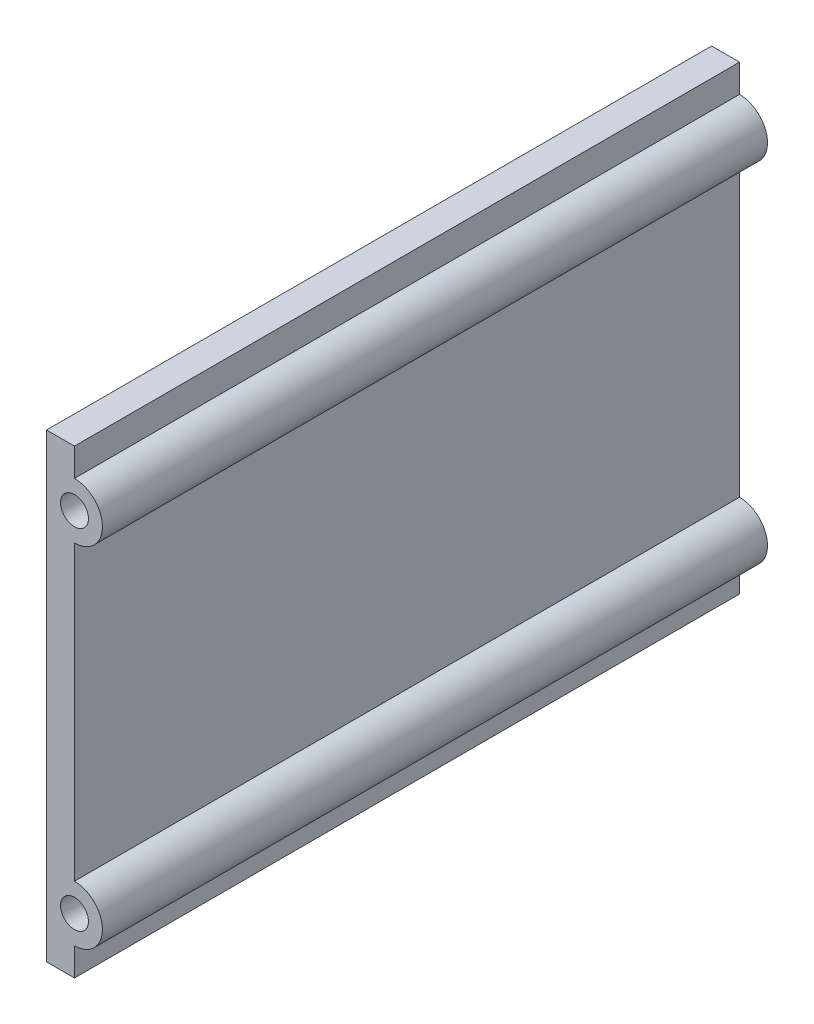
ISO-10303-21;
HEADER;
FILE_DESCRIPTION(('STEP AP214'),'2;1');
FILE_NAME('part.step','',(''),(''),'','','');
FILE_SCHEMA(('AUTOMOTIVE_DESIGN { 1 0 10303 214 1 1 1 1 }'));
ENDSEC;
DATA;
#1=APPLICATION_CONTEXT('core data for automotive mechanical design processes');
#2=APPLICATION_PROTOCOL_DEFINITION('international standard','automotive_design',2000,#1);
#3=PRODUCT_CONTEXT('',#1,'mechanical');
#4=PRODUCT('Part','Part','',(#3));
#5=PRODUCT_RELATED_PRODUCT_CATEGORY('part','',(#4));
#6=PRODUCT_DEFINITION_FORMATION('','',#4);
#7=PRODUCT_DEFINITION_CONTEXT('part definition',#1,'design');
#8=PRODUCT_DEFINITION('design','',#6,#7);
#9=PRODUCT_DEFINITION_SHAPE('','',#8);
#10=(LENGTH_UNIT() NAMED_UNIT(*) SI_UNIT(.MILLI.,.METRE.));
#11=(NAMED_UNIT(*) PLANE_ANGLE_UNIT() SI_UNIT($,.RADIAN.));
#12=(NAMED_UNIT(*) SI_UNIT($,.STERADIAN.) SOLID_ANGLE_UNIT());
#13=UNCERTAINTY_MEASURE_WITH_UNIT(LENGTH_MEASURE(1.E-05),#10,'distance_accuracy_value','');
#14=(GEOMETRIC_REPRESENTATION_CONTEXT(3) GLOBAL_UNCERTAINTY_ASSIGNED_CONTEXT((#13)) GLOBAL_UNIT_ASSIGNED_CONTEXT((#10,
#11,#12)) REPRESENTATION_CONTEXT('',''));
#15=CARTESIAN_POINT('',(0.,0.,0.));
#16=DIRECTION('',(0.,0.,1.));
#17=DIRECTION('',(1.,0.,0.));
#18=AXIS2_PLACEMENT_3D('',#15,#16,#17);
#19=CARTESIAN_POINT('',(-161.500000000327,31.210634294359,202.025691901636));
#20=DIRECTION('',(0.,0.,-1.));
#21=DIRECTION('',(-1.,0.,0.));
#22=AXIS2_PLACEMENT_3D('',#19,#20,#21);
#23=CYLINDRICAL_SURFACE('',#22,2.5);
#24=CARTESIAN_POINT('',(-161.500000000327,31.210634294359,0.));
#25=DIRECTION('',(0.,0.,1.));
#26=DIRECTION('',(1.,0.,0.));
#27=AXIS2_PLACEMENT_3D('',#24,#25,#26);
#28=CIRCLE('',#27,2.5);
#29=CARTESIAN_POINT('',(-159.000000000327,31.210634294359,0.));
#30=VERTEX_POINT('',#29);
#31=EDGE_CURVE('E140',#30,#30,#28,.T.);
#32=ORIENTED_EDGE('',*,*,#31,.F.);
#33=EDGE_LOOP('',(#32));
#34=FACE_BOUND('',#33,.T.);
#35=CARTESIAN_POINT('',(-161.500000000327,31.210634294359,118.999999999998));
#36=DIRECTION('',(0.,0.,1.));
#37=DIRECTION('',(0.,-1.,0.));
#38=AXIS2_PLACEMENT_3D('',#35,#36,#37);
#39=CIRCLE('',#38,2.5);
#40=CARTESIAN_POINT('',(-161.500000000327,28.710634294359,118.999999999998));
#41=VERTEX_POINT('',#40);
#42=EDGE_CURVE('E120',#41,#41,#39,.T.);
#43=ORIENTED_EDGE('',*,*,#42,.T.);
#44=EDGE_LOOP('',(#43));
#45=FACE_BOUND('',#44,.T.);
#46=ADVANCED_FACE('F35',(#34,#45),#23,.F.);
#47=CARTESIAN_POINT('',(-161.500000000317,26.2106342943589,202.025691901636));
#48=DIRECTION('',(-1.,0.,0.));
#49=DIRECTION('',(0.,0.,1.));
#50=AXIS2_PLACEMENT_3D('',#47,#48,#49);
#51=PLANE('',#50);
#52=DIRECTION('',(0.,1.,0.));
#53=VECTOR('',#52,1.);
#54=CARTESIAN_POINT('',(-161.500000000317,26.2106342943537,118.999999999998));
#55=LINE('',#54,#53);
#56=CARTESIAN_POINT('',(-161.500000000317,-26.2106342941675,119.));
#57=VERTEX_POINT('',#56);
#58=CARTESIAN_POINT('',(-161.500000000317,26.2106342943589,118.999999999998));
#59=VERTEX_POINT('',#58);
#60=EDGE_CURVE('E104',#57,#59,#55,.T.);
#61=ORIENTED_EDGE('',*,*,#60,.F.);
#62=DIRECTION('',(0.,0.,-1.));
#63=VECTOR('',#62,1.);
#64=CARTESIAN_POINT('',(-161.500000000317,-26.2106342941675,202.025691901636));
#65=LINE('',#64,#63);
#66=CARTESIAN_POINT('',(-161.500000000317,-26.2106342941675,0.));
#67=VERTEX_POINT('',#66);
#68=EDGE_CURVE('E51',#57,#67,#65,.T.);
#69=ORIENTED_EDGE('',*,*,#68,.T.);
#70=DIRECTION('',(0.,1.,0.));
#71=VECTOR('',#70,1.);
#72=CARTESIAN_POINT('',(-161.500000000317,26.2106342943589,0.));
#73=LINE('',#72,#71);
#74=CARTESIAN_POINT('',(-161.500000000317,26.2106342943589,0.));
#75=VERTEX_POINT('',#74);
#76=EDGE_CURVE('E107',#67,#75,#73,.T.);
#77=ORIENTED_EDGE('',*,*,#76,.T.);
#78=DIRECTION('',(0.,0.,-1.));
#79=VECTOR('',#78,1.);
#80=CARTESIAN_POINT('',(-161.500000000317,26.2106342943589,202.025691901636));
#81=LINE('',#80,#79);
#82=EDGE_CURVE('E100',#59,#75,#81,.T.);
#83=ORIENTED_EDGE('',*,*,#82,.F.);
#84=EDGE_LOOP('',(#61,#69,#77,#83));
#85=FACE_BOUND('',#84,.T.);
#86=ADVANCED_FACE('F102',(#85),#51,.F.);
#87=CARTESIAN_POINT('',(-161.500000000317,-31.2106342941764,202.025691901636));
#88=DIRECTION('',(0.,0.,-1.));
#89=DIRECTION('',(-1.,0.,0.));
#90=AXIS2_PLACEMENT_3D('',#87,#88,#89);
#91=CYLINDRICAL_SURFACE('',#90,5.00000000000894);
#92=CARTESIAN_POINT('',(-161.500000000317,-31.2106342941764,119.000000000002));
#93=DIRECTION('',(0.,0.,1.));
#94=DIRECTION('',(0.,-1.,0.));
#95=AXIS2_PLACEMENT_3D('',#92,#93,#94);
#96=CIRCLE('',#95,5.00000000000894);
#97=CARTESIAN_POINT('',(-161.500000000317,-36.2106342941854,119.000000000002));
#98=VERTEX_POINT('',#97);
#99=EDGE_CURVE('E119',#98,#57,#96,.T.);
#100=ORIENTED_EDGE('',*,*,#99,.F.);
#101=DIRECTION('',(0.,0.,-1.));
#102=VECTOR('',#101,1.);
#103=CARTESIAN_POINT('',(-161.500000000317,-36.2106342941854,202.025691901636));
#104=LINE('',#103,#102);
#105=CARTESIAN_POINT('',(-161.500000000317,-36.2106342941854,0.));
#106=VERTEX_POINT('',#105);
#107=EDGE_CURVE('E164',#98,#106,#104,.T.);
#108=ORIENTED_EDGE('',*,*,#107,.T.);
#109=CARTESIAN_POINT('',(-161.500000000317,-31.2106342941764,0.));
#110=DIRECTION('',(0.,0.,1.));
#111=DIRECTION('',(1.,0.,0.));
#112=AXIS2_PLACEMENT_3D('',#109,#110,#111);
#113=CIRCLE('',#112,5.00000000000894);
#114=EDGE_CURVE('E160',#106,#67,#113,.T.);
#115=ORIENTED_EDGE('',*,*,#114,.T.);
#116=ORIENTED_EDGE('',*,*,#68,.F.);
#117=EDGE_LOOP('',(#100,#108,#115,#116));
#118=FACE_BOUND('',#117,.T.);
#119=ADVANCED_FACE('F194',(#118),#91,.T.);
#120=CARTESIAN_POINT('',(-161.500000000317,-36.2106342941854,202.025691901636));
#121=DIRECTION('',(-1.,0.,0.));
#122=DIRECTION('',(0.,0.,1.));
#123=AXIS2_PLACEMENT_3D('',#120,#121,#122);
#124=PLANE('',#123);
#125=DIRECTION('',(0.,1.,0.));
#126=VECTOR('',#125,1.);
#127=CARTESIAN_POINT('',(-161.500000000317,-36.2106342941906,119.000000000002));
#128=LINE('',#127,#126);
#129=CARTESIAN_POINT('',(-161.500000000317,-41.2106342941854,119.000000000002));
#130=VERTEX_POINT('',#129);
#131=EDGE_CURVE('E122',#130,#98,#128,.T.);
#132=ORIENTED_EDGE('',*,*,#131,.F.);
#133=DIRECTION('',(0.,0.,-1.));
#134=VECTOR('',#133,1.);
#135=CARTESIAN_POINT('',(-161.500000000317,-41.2106342941854,202.025691901636));
#136=LINE('',#135,#134);
#137=CARTESIAN_POINT('',(-161.500000000317,-41.2106342941854,0.));
#138=VERTEX_POINT('',#137);
#139=EDGE_CURVE('E166',#130,#138,#136,.T.);
#140=ORIENTED_EDGE('',*,*,#139,.T.);
#141=DIRECTION('',(0.,1.,0.));
#142=VECTOR('',#141,1.);
#143=CARTESIAN_POINT('',(-161.500000000317,-36.2106342941854,0.));
#144=LINE('',#143,#142);
#145=EDGE_CURVE('E157',#138,#106,#144,.T.);
#146=ORIENTED_EDGE('',*,*,#145,.T.);
#147=ORIENTED_EDGE('',*,*,#107,.F.);
#148=EDGE_LOOP('',(#132,#140,#146,#147));
#149=FACE_BOUND('',#148,.T.);
#150=ADVANCED_FACE('F191',(#149),#124,.F.);
#151=CARTESIAN_POINT('',(-161.500000000317,-41.2106342941854,202.025691901636));
#152=DIRECTION('',(0.,1.,0.));
#153=DIRECTION('',(0.,0.,1.));
#154=AXIS2_PLACEMENT_3D('',#151,#152,#153);
#155=PLANE('',#154);
#156=DIRECTION('',(1.,0.,0.));
#157=VECTOR('',#156,1.);
#158=CARTESIAN_POINT('',(-161.500000000316,-41.2106342941854,119.000000000003));
#159=LINE('',#158,#157);
#160=CARTESIAN_POINT('',(-166.500000000327,-41.2106342941854,119.000000000002));
#161=VERTEX_POINT('',#160);
#162=EDGE_CURVE('E128',#161,#130,#159,.T.);
#163=ORIENTED_EDGE('',*,*,#162,.F.);
#164=DIRECTION('',(0.,0.,-1.));
#165=VECTOR('',#164,1.);
#166=CARTESIAN_POINT('',(-166.500000000327,-41.2106342941854,202.025691901636));
#167=LINE('',#166,#165);
#168=CARTESIAN_POINT('',(-166.500000000327,-41.2106342941854,0.));
#169=VERTEX_POINT('',#168);
#170=EDGE_CURVE('E168',#161,#169,#167,.T.);
#171=ORIENTED_EDGE('',*,*,#170,.T.);
#172=DIRECTION('',(1.,0.,0.));
#173=VECTOR('',#172,1.);
#174=CARTESIAN_POINT('',(-161.500000000317,-41.2106342941854,0.));
#175=LINE('',#174,#173);
#176=EDGE_CURVE('E154',#169,#138,#175,.T.);
#177=ORIENTED_EDGE('',*,*,#176,.T.);
#178=ORIENTED_EDGE('',*,*,#139,.F.);
#179=EDGE_LOOP('',(#163,#171,#177,#178));
#180=FACE_BOUND('',#179,.T.);
#181=ADVANCED_FACE('F189',(#180),#155,.F.);
#182=CARTESIAN_POINT('',(-166.500000000327,-41.2106342941854,202.025691901636));
#183=DIRECTION('',(1.,0.,0.));
#184=DIRECTION('',(0.,0.,-1.));
#185=AXIS2_PLACEMENT_3D('',#182,#183,#184);
#186=PLANE('',#185);
#187=DIRECTION('',(0.,-1.,0.));
#188=VECTOR('',#187,1.);
#189=CARTESIAN_POINT('',(-166.500000000327,-41.2106342941906,119.000000000002));
#190=LINE('',#189,#188);
#191=CARTESIAN_POINT('',(-166.500000000327,41.210634294359,119.));
#192=VERTEX_POINT('',#191);
#193=EDGE_CURVE('E131',#192,#161,#190,.T.);
#194=ORIENTED_EDGE('',*,*,#193,.F.);
#195=DIRECTION('',(0.,0.,-1.));
#196=VECTOR('',#195,1.);
#197=CARTESIAN_POINT('',(-166.500000000327,41.210634294359,202.025691901636));
#198=LINE('',#197,#196);
#199=CARTESIAN_POINT('',(-166.500000000327,41.210634294359,0.));
#200=VERTEX_POINT('',#199);
#201=EDGE_CURVE('E170',#192,#200,#198,.T.);
#202=ORIENTED_EDGE('',*,*,#201,.T.);
#203=DIRECTION('',(0.,-1.,0.));
#204=VECTOR('',#203,1.);
#205=CARTESIAN_POINT('',(-166.500000000327,-41.2106342941854,0.));
#206=LINE('',#205,#204);
#207=EDGE_CURVE('E151',#200,#169,#206,.T.);
#208=ORIENTED_EDGE('',*,*,#207,.T.);
#209=ORIENTED_EDGE('',*,*,#170,.F.);
#210=EDGE_LOOP('',(#194,#202,#208,#209));
#211=FACE_BOUND('',#210,.T.);
#212=ADVANCED_FACE('F186',(#211),#186,.F.);
#213=CARTESIAN_POINT('',(-161.500000000317,41.210634294359,202.025691901636));
#214=DIRECTION('',(0.,-1.,0.));
#215=DIRECTION('',(0.,0.,-1.));
#216=AXIS2_PLACEMENT_3D('',#213,#214,#215);
#217=PLANE('',#216);
#218=DIRECTION('',(-1.,0.,0.));
#219=VECTOR('',#218,1.);
#220=CARTESIAN_POINT('',(-161.500000000316,41.210634294359,118.999999999997));
#221=LINE('',#220,#219);
#222=CARTESIAN_POINT('',(-161.500000000317,41.210634294359,118.999999999997));
#223=VERTEX_POINT('',#222);
#224=EDGE_CURVE('E134',#223,#192,#221,.T.);
#225=ORIENTED_EDGE('',*,*,#224,.F.);
#226=DIRECTION('',(0.,0.,-1.));
#227=VECTOR('',#226,1.);
#228=CARTESIAN_POINT('',(-161.500000000317,41.210634294359,202.025691901636));
#229=LINE('',#228,#227);
#230=CARTESIAN_POINT('',(-161.500000000317,41.210634294359,0.));
#231=VERTEX_POINT('',#230);
#232=EDGE_CURVE('E44',#223,#231,#229,.T.);
#233=ORIENTED_EDGE('',*,*,#232,.T.);
#234=DIRECTION('',(-1.,0.,0.));
#235=VECTOR('',#234,1.);
#236=CARTESIAN_POINT('',(-161.500000000317,41.210634294359,0.));
#237=LINE('',#236,#235);
#238=EDGE_CURVE('E148',#231,#200,#237,.T.);
#239=ORIENTED_EDGE('',*,*,#238,.T.);
#240=ORIENTED_EDGE('',*,*,#201,.F.);
#241=EDGE_LOOP('',(#225,#233,#239,#240));
#242=FACE_BOUND('',#241,.T.);
#243=ADVANCED_FACE('F173',(#242),#217,.F.);
#244=CARTESIAN_POINT('',(-161.500000000317,36.210634294359,202.025691901636));
#245=DIRECTION('',(-1.,0.,0.));
#246=DIRECTION('',(0.,0.,1.));
#247=AXIS2_PLACEMENT_3D('',#244,#245,#246);
#248=PLANE('',#247);
#249=DIRECTION('',(0.,1.,0.));
#250=VECTOR('',#249,1.);
#251=CARTESIAN_POINT('',(-161.500000000317,36.2106342943538,118.999999999998));
#252=LINE('',#251,#250);
#253=CARTESIAN_POINT('',(-161.500000000317,36.210634294359,118.999999999997));
#254=VERTEX_POINT('',#253);
#255=EDGE_CURVE('E58',#254,#223,#252,.T.);
#256=ORIENTED_EDGE('',*,*,#255,.F.);
#257=DIRECTION('',(0.,0.,-1.));
#258=VECTOR('',#257,1.);
#259=CARTESIAN_POINT('',(-161.500000000317,36.210634294359,202.025691901636));
#260=LINE('',#259,#258);
#261=CARTESIAN_POINT('',(-161.500000000317,36.210634294359,0.));
#262=VERTEX_POINT('',#261);
#263=EDGE_CURVE('E11',#254,#262,#260,.T.);
#264=ORIENTED_EDGE('',*,*,#263,.T.);
#265=DIRECTION('',(0.,1.,0.));
#266=VECTOR('',#265,1.);
#267=CARTESIAN_POINT('',(-161.500000000317,36.210634294359,0.));
#268=LINE('',#267,#266);
#269=EDGE_CURVE('E145',#262,#231,#268,.T.);
#270=ORIENTED_EDGE('',*,*,#269,.T.);
#271=ORIENTED_EDGE('',*,*,#232,.F.);
#272=EDGE_LOOP('',(#256,#264,#270,#271));
#273=FACE_BOUND('',#272,.T.);
#274=ADVANCED_FACE('F177',(#273),#248,.F.);
#275=CARTESIAN_POINT('',(-161.500000000327,31.210634294359,202.025691901636));
#276=DIRECTION('',(0.,0.,-1.));
#277=DIRECTION('',(-1.,0.,0.));
#278=AXIS2_PLACEMENT_3D('',#275,#276,#277);
#279=CYLINDRICAL_SURFACE('',#278,5.00000000000003);
#280=CARTESIAN_POINT('',(-161.500000000327,31.210634294359,118.999999999998));
#281=DIRECTION('',(0.,0.,1.));
#282=DIRECTION('',(0.,-1.,0.));
#283=AXIS2_PLACEMENT_3D('',#280,#281,#282);
#284=CIRCLE('',#283,5.00000000000003);
#285=EDGE_CURVE('E113',#59,#254,#284,.T.);
#286=ORIENTED_EDGE('',*,*,#285,.F.);
#287=ORIENTED_EDGE('',*,*,#82,.T.);
#288=CARTESIAN_POINT('',(-161.500000000327,31.210634294359,0.));
#289=DIRECTION('',(0.,0.,1.));
#290=DIRECTION('',(1.,0.,0.));
#291=AXIS2_PLACEMENT_3D('',#288,#289,#290);
#292=CIRCLE('',#291,5.00000000000003);
#293=EDGE_CURVE('E143',#75,#262,#292,.T.);
#294=ORIENTED_EDGE('',*,*,#293,.T.);
#295=ORIENTED_EDGE('',*,*,#263,.F.);
#296=EDGE_LOOP('',(#286,#287,#294,#295));
#297=FACE_BOUND('',#296,.T.);
#298=ADVANCED_FACE('F37',(#297),#279,.T.);
#299=CARTESIAN_POINT('',(-161.500000000327,31.210634294359,0.));
#300=DIRECTION('',(0.,0.,1.));
#301=DIRECTION('',(1.,0.,0.));
#302=AXIS2_PLACEMENT_3D('',#299,#300,#301);
#303=PLANE('',#302);
#304=ORIENTED_EDGE('',*,*,#293,.F.);
#305=ORIENTED_EDGE('',*,*,#76,.F.);
#306=ORIENTED_EDGE('',*,*,#114,.F.);
#307=ORIENTED_EDGE('',*,*,#145,.F.);
#308=ORIENTED_EDGE('',*,*,#176,.F.);
#309=ORIENTED_EDGE('',*,*,#207,.F.);
#310=ORIENTED_EDGE('',*,*,#238,.F.);
#311=ORIENTED_EDGE('',*,*,#269,.F.);
#312=EDGE_LOOP('',(#304,#305,#306,#307,#308,#309,#310,#311));
#313=FACE_BOUND('',#312,.T.);
#314=ORIENTED_EDGE('',*,*,#31,.T.);
#315=EDGE_LOOP('',(#314));
#316=FACE_BOUND('',#315,.T.);
#317=CARTESIAN_POINT('',(-161.500000000317,-31.2106342941764,0.));
#318=DIRECTION('',(0.,0.,1.));
#319=DIRECTION('',(1.,0.,0.));
#320=AXIS2_PLACEMENT_3D('',#317,#318,#319);
#321=CIRCLE('',#320,2.5);
#322=CARTESIAN_POINT('',(-159.000000000317,-31.2106342941764,0.));
#323=VERTEX_POINT('',#322);
#324=EDGE_CURVE('E115',#323,#323,#321,.T.);
#325=ORIENTED_EDGE('',*,*,#324,.T.);
#326=EDGE_LOOP('',(#325));
#327=FACE_BOUND('',#326,.T.);
#328=ADVANCED_FACE('F180',(#313,#316,#327),#303,.F.);
#329=CARTESIAN_POINT('',(-161.500000000317,-31.2106342941764,202.025691901636));
#330=DIRECTION('',(0.,0.,-1.));
#331=DIRECTION('',(-1.,0.,0.));
#332=AXIS2_PLACEMENT_3D('',#329,#330,#331);
#333=CYLINDRICAL_SURFACE('',#332,2.5);
#334=ORIENTED_EDGE('',*,*,#324,.F.);
#335=EDGE_LOOP('',(#334));
#336=FACE_BOUND('',#335,.T.);
#337=CARTESIAN_POINT('',(-161.500000000317,-31.2106342941764,119.000000000002));
#338=DIRECTION('',(0.,0.,1.));
#339=DIRECTION('',(0.,-1.,0.));
#340=AXIS2_PLACEMENT_3D('',#337,#338,#339);
#341=CIRCLE('',#340,2.5);
#342=CARTESIAN_POINT('',(-161.500000000317,-33.7106342941764,119.000000000002));
#343=VERTEX_POINT('',#342);
#344=EDGE_CURVE('E39',#343,#343,#341,.T.);
#345=ORIENTED_EDGE('',*,*,#344,.T.);
#346=EDGE_LOOP('',(#345));
#347=FACE_BOUND('',#346,.T.);
#348=ADVANCED_FACE('F212',(#336,#347),#333,.F.);
#349=CARTESIAN_POINT('',(-9.54547552112217E-12,2.07049052970551E-10,119.000000000003));
#350=DIRECTION('',(0.,0.,1.));
#351=DIRECTION('',(-1.,1.28311973053189E-13,0.));
#352=AXIS2_PLACEMENT_3D('',#349,#350,#351);
#353=PLANE('',#352);
#354=ORIENTED_EDGE('',*,*,#344,.F.);
#355=EDGE_LOOP('',(#354));
#356=FACE_BOUND('',#355,.T.);
#357=ORIENTED_EDGE('',*,*,#42,.F.);
#358=EDGE_LOOP('',(#357));
#359=FACE_BOUND('',#358,.T.);
#360=ORIENTED_EDGE('',*,*,#60,.T.);
#361=ORIENTED_EDGE('',*,*,#285,.T.);
#362=ORIENTED_EDGE('',*,*,#255,.T.);
#363=ORIENTED_EDGE('',*,*,#224,.T.);
#364=ORIENTED_EDGE('',*,*,#193,.T.);
#365=ORIENTED_EDGE('',*,*,#162,.T.);
#366=ORIENTED_EDGE('',*,*,#131,.T.);
#367=ORIENTED_EDGE('',*,*,#99,.T.);
#368=EDGE_LOOP('',(#360,#361,#362,#363,#364,#365,#366,#367));
#369=FACE_BOUND('',#368,.T.);
#370=ADVANCED_FACE('F117',(#356,#359,#369),#353,.T.);
#371=CLOSED_SHELL('',(#46,#86,#119,#150,#181,#212,#243,#274,#298,#328,#348,#370));
#372=MANIFOLD_SOLID_BREP('B2',#371);
#373=ADVANCED_BREP_SHAPE_REPRESENTATION('',(#18,#372),#14);
#374=SHAPE_DEFINITION_REPRESENTATION(#9,#373);
ENDSEC;
END-ISO-10303-21;
